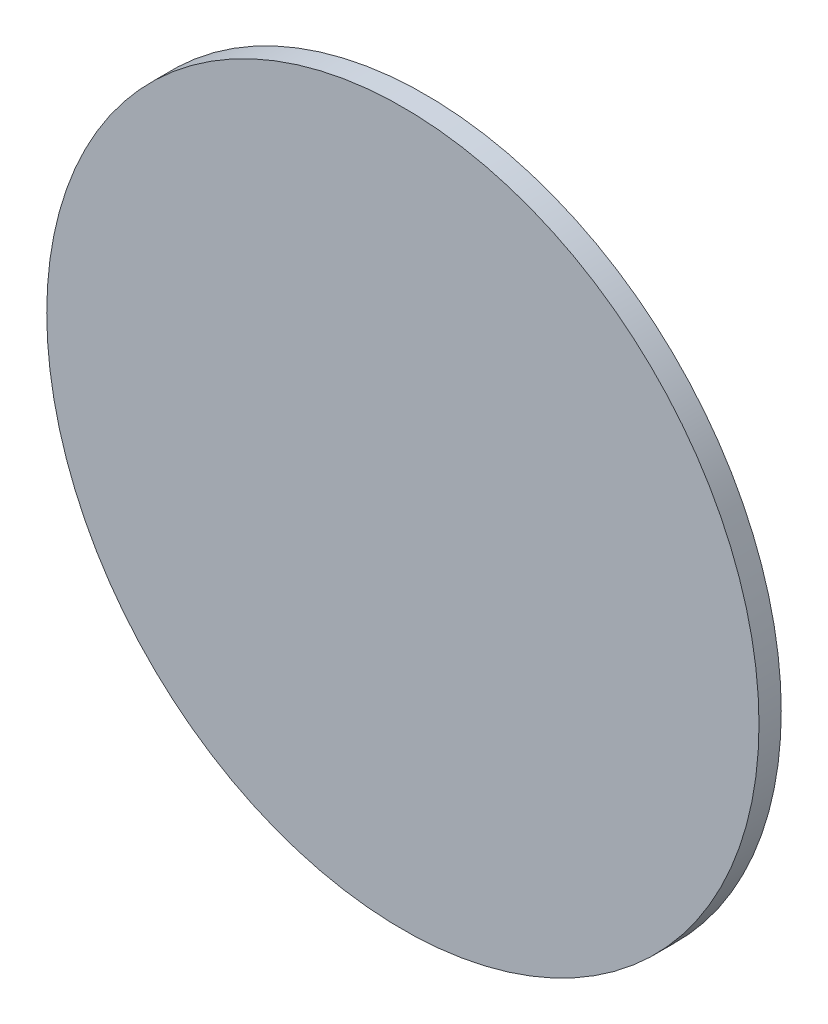
ISO-10303-21;
HEADER;
FILE_DESCRIPTION(('STEP AP214'),'2;1');
FILE_NAME('part.step','',(''),(''),'','','');
FILE_SCHEMA(('AUTOMOTIVE_DESIGN { 1 0 10303 214 1 1 1 1 }'));
ENDSEC;
DATA;
#1=APPLICATION_CONTEXT('core data for automotive mechanical design processes');
#2=APPLICATION_PROTOCOL_DEFINITION('international standard','automotive_design',2000,#1);
#3=PRODUCT_CONTEXT('',#1,'mechanical');
#4=PRODUCT('Part','Part','',(#3));
#5=PRODUCT_RELATED_PRODUCT_CATEGORY('part','',(#4));
#6=PRODUCT_DEFINITION_FORMATION('','',#4);
#7=PRODUCT_DEFINITION_CONTEXT('part definition',#1,'design');
#8=PRODUCT_DEFINITION('design','',#6,#7);
#9=PRODUCT_DEFINITION_SHAPE('','',#8);
#10=(LENGTH_UNIT() NAMED_UNIT(*) SI_UNIT(.MILLI.,.METRE.));
#11=(NAMED_UNIT(*) PLANE_ANGLE_UNIT() SI_UNIT($,.RADIAN.));
#12=(NAMED_UNIT(*) SI_UNIT($,.STERADIAN.) SOLID_ANGLE_UNIT());
#13=UNCERTAINTY_MEASURE_WITH_UNIT(LENGTH_MEASURE(1.E-05),#10,'distance_accuracy_value','');
#14=(GEOMETRIC_REPRESENTATION_CONTEXT(3) GLOBAL_UNCERTAINTY_ASSIGNED_CONTEXT((#13)) GLOBAL_UNIT_ASSIGNED_CONTEXT((#10,
#11,#12)) REPRESENTATION_CONTEXT('',''));
#15=CARTESIAN_POINT('',(0.,0.,0.));
#16=DIRECTION('',(0.,0.,1.));
#17=DIRECTION('',(1.,0.,0.));
#18=AXIS2_PLACEMENT_3D('',#15,#16,#17);
#19=CARTESIAN_POINT('',(0.,0.,1.));
#20=DIRECTION('',(0.,0.,-1.));
#21=DIRECTION('',(-1.,0.,0.));
#22=AXIS2_PLACEMENT_3D('',#19,#20,#21);
#23=CYLINDRICAL_SURFACE('',#22,16.);
#24=CARTESIAN_POINT('',(0.,0.,1.));
#25=DIRECTION('',(0.,0.,-1.));
#26=DIRECTION('',(-1.,0.,0.));
#27=AXIS2_PLACEMENT_3D('',#24,#25,#26);
#28=CIRCLE('',#27,16.);
#29=CARTESIAN_POINT('',(-16.,0.,1.));
#30=VERTEX_POINT('',#29);
#31=EDGE_CURVE('E10',#30,#30,#28,.T.);
#32=ORIENTED_EDGE('',*,*,#31,.T.);
#33=EDGE_LOOP('',(#32));
#34=FACE_BOUND('',#33,.T.);
#35=CARTESIAN_POINT('',(0.,0.,0.));
#36=DIRECTION('',(0.,0.,-1.));
#37=DIRECTION('',(-1.,0.,0.));
#38=AXIS2_PLACEMENT_3D('',#35,#36,#37);
#39=CIRCLE('',#38,16.);
#40=CARTESIAN_POINT('',(-16.,0.,0.));
#41=VERTEX_POINT('',#40);
#42=EDGE_CURVE('E36',#41,#41,#39,.T.);
#43=ORIENTED_EDGE('',*,*,#42,.F.);
#44=EDGE_LOOP('',(#43));
#45=FACE_BOUND('',#44,.T.);
#46=ADVANCED_FACE('F33',(#34,#45),#23,.T.);
#47=CARTESIAN_POINT('',(0.,0.,1.));
#48=DIRECTION('',(0.,0.,-1.));
#49=DIRECTION('',(-1.,0.,0.));
#50=AXIS2_PLACEMENT_3D('',#47,#48,#49);
#51=PLANE('',#50);
#52=ORIENTED_EDGE('',*,*,#31,.F.);
#53=EDGE_LOOP('',(#52));
#54=FACE_BOUND('',#53,.T.);
#55=ADVANCED_FACE('F48',(#54),#51,.F.);
#56=CARTESIAN_POINT('',(0.,0.,0.));
#57=DIRECTION('',(0.,0.,-1.));
#58=DIRECTION('',(-1.,0.,0.));
#59=AXIS2_PLACEMENT_3D('',#56,#57,#58);
#60=PLANE('',#59);
#61=ORIENTED_EDGE('',*,*,#42,.T.);
#62=EDGE_LOOP('',(#61));
#63=FACE_BOUND('',#62,.T.);
#64=ADVANCED_FACE('F45',(#63),#60,.T.);
#65=CLOSED_SHELL('',(#46,#55,#64));
#66=MANIFOLD_SOLID_BREP('B2',#65);
#67=ADVANCED_BREP_SHAPE_REPRESENTATION('',(#18,#66),#14);
#68=SHAPE_DEFINITION_REPRESENTATION(#9,#67);
ENDSEC;
END-ISO-10303-21;
